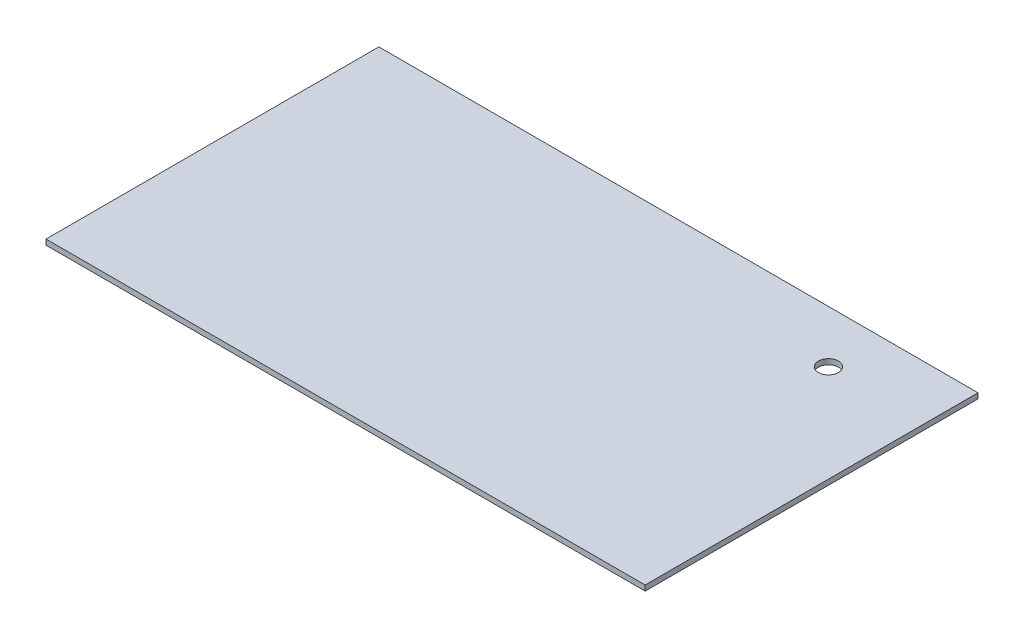
ISO-10303-21;
HEADER;
FILE_DESCRIPTION(('STEP AP214'),'2;1');
FILE_NAME('part.step','',(''),(''),'','','');
FILE_SCHEMA(('AUTOMOTIVE_DESIGN { 1 0 10303 214 1 1 1 1 }'));
ENDSEC;
DATA;
#1=APPLICATION_CONTEXT('core data for automotive mechanical design processes');
#2=APPLICATION_PROTOCOL_DEFINITION('international standard','automotive_design',2000,#1);
#3=PRODUCT_CONTEXT('',#1,'mechanical');
#4=PRODUCT('Part','Part','',(#3));
#5=PRODUCT_RELATED_PRODUCT_CATEGORY('part','',(#4));
#6=PRODUCT_DEFINITION_FORMATION('','',#4);
#7=PRODUCT_DEFINITION_CONTEXT('part definition',#1,'design');
#8=PRODUCT_DEFINITION('design','',#6,#7);
#9=PRODUCT_DEFINITION_SHAPE('','',#8);
#10=(LENGTH_UNIT() NAMED_UNIT(*) SI_UNIT(.MILLI.,.METRE.));
#11=(NAMED_UNIT(*) PLANE_ANGLE_UNIT() SI_UNIT($,.RADIAN.));
#12=(NAMED_UNIT(*) SI_UNIT($,.STERADIAN.) SOLID_ANGLE_UNIT());
#13=UNCERTAINTY_MEASURE_WITH_UNIT(LENGTH_MEASURE(1.E-05),#10,'distance_accuracy_value','');
#14=(GEOMETRIC_REPRESENTATION_CONTEXT(3) GLOBAL_UNCERTAINTY_ASSIGNED_CONTEXT((#13)) GLOBAL_UNIT_ASSIGNED_CONTEXT((#10,
#11,#12)) REPRESENTATION_CONTEXT('',''));
#15=CARTESIAN_POINT('',(0.,0.,0.));
#16=DIRECTION('',(0.,0.,1.));
#17=DIRECTION('',(1.,0.,0.));
#18=AXIS2_PLACEMENT_3D('',#15,#16,#17);
#19=CARTESIAN_POINT('',(0.,4.,-250.));
#20=DIRECTION('',(1.,0.,0.));
#21=DIRECTION('',(0.,0.,-1.));
#22=AXIS2_PLACEMENT_3D('',#19,#20,#21);
#23=PLANE('',#22);
#24=DIRECTION('',(0.,0.,1.));
#25=VECTOR('',#24,1.);
#26=CARTESIAN_POINT('',(0.,0.,-250.));
#27=LINE('',#26,#25);
#28=CARTESIAN_POINT('',(0.,0.,-250.));
#29=VERTEX_POINT('',#28);
#30=CARTESIAN_POINT('',(0.,0.,0.));
#31=VERTEX_POINT('',#30);
#32=EDGE_CURVE('E96',#29,#31,#27,.T.);
#33=ORIENTED_EDGE('',*,*,#32,.T.);
#34=DIRECTION('',(0.,-1.,0.));
#35=VECTOR('',#34,1.);
#36=CARTESIAN_POINT('',(0.,4.,0.));
#37=LINE('',#36,#35);
#38=CARTESIAN_POINT('',(0.,4.,0.));
#39=VERTEX_POINT('',#38);
#40=EDGE_CURVE('E11',#39,#31,#37,.T.);
#41=ORIENTED_EDGE('',*,*,#40,.F.);
#42=DIRECTION('',(0.,0.,1.));
#43=VECTOR('',#42,1.);
#44=CARTESIAN_POINT('',(0.,4.,-250.));
#45=LINE('',#44,#43);
#46=CARTESIAN_POINT('',(0.,4.,-250.));
#47=VERTEX_POINT('',#46);
#48=EDGE_CURVE('E84',#47,#39,#45,.T.);
#49=ORIENTED_EDGE('',*,*,#48,.F.);
#50=DIRECTION('',(0.,-1.,0.));
#51=VECTOR('',#50,1.);
#52=CARTESIAN_POINT('',(0.,4.,-250.));
#53=LINE('',#52,#51);
#54=EDGE_CURVE('E92',#47,#29,#53,.T.);
#55=ORIENTED_EDGE('',*,*,#54,.T.);
#56=EDGE_LOOP('',(#33,#41,#49,#55));
#57=FACE_BOUND('',#56,.T.);
#58=ADVANCED_FACE('F33',(#57),#23,.F.);
#59=CARTESIAN_POINT('',(0.,4.,0.));
#60=DIRECTION('',(0.,0.,-1.));
#61=DIRECTION('',(-1.,0.,0.));
#62=AXIS2_PLACEMENT_3D('',#59,#60,#61);
#63=PLANE('',#62);
#64=DIRECTION('',(1.,0.,0.));
#65=VECTOR('',#64,1.);
#66=CARTESIAN_POINT('',(0.,0.,0.));
#67=LINE('',#66,#65);
#68=CARTESIAN_POINT('',(450.,0.,0.));
#69=VERTEX_POINT('',#68);
#70=EDGE_CURVE('E88',#31,#69,#67,.T.);
#71=ORIENTED_EDGE('',*,*,#70,.T.);
#72=DIRECTION('',(0.,-1.,0.));
#73=VECTOR('',#72,1.);
#74=CARTESIAN_POINT('',(450.,4.,0.));
#75=LINE('',#74,#73);
#76=CARTESIAN_POINT('',(450.,4.,0.));
#77=VERTEX_POINT('',#76);
#78=EDGE_CURVE('E41',#77,#69,#75,.T.);
#79=ORIENTED_EDGE('',*,*,#78,.F.);
#80=DIRECTION('',(1.,0.,0.));
#81=VECTOR('',#80,1.);
#82=CARTESIAN_POINT('',(0.,4.,0.));
#83=LINE('',#82,#81);
#84=EDGE_CURVE('E79',#39,#77,#83,.T.);
#85=ORIENTED_EDGE('',*,*,#84,.F.);
#86=ORIENTED_EDGE('',*,*,#40,.T.);
#87=EDGE_LOOP('',(#71,#79,#85,#86));
#88=FACE_BOUND('',#87,.T.);
#89=ADVANCED_FACE('F87',(#88),#63,.F.);
#90=CARTESIAN_POINT('',(450.,4.,0.));
#91=DIRECTION('',(-1.,0.,0.));
#92=DIRECTION('',(0.,0.,1.));
#93=AXIS2_PLACEMENT_3D('',#90,#91,#92);
#94=PLANE('',#93);
#95=DIRECTION('',(0.,0.,-1.));
#96=VECTOR('',#95,1.);
#97=CARTESIAN_POINT('',(450.,0.,0.));
#98=LINE('',#97,#96);
#99=CARTESIAN_POINT('',(450.,0.,-250.));
#100=VERTEX_POINT('',#99);
#101=EDGE_CURVE('E66',#69,#100,#98,.T.);
#102=ORIENTED_EDGE('',*,*,#101,.T.);
#103=DIRECTION('',(0.,-1.,0.));
#104=VECTOR('',#103,1.);
#105=CARTESIAN_POINT('',(450.,4.,-250.));
#106=LINE('',#105,#104);
#107=CARTESIAN_POINT('',(450.,4.,-250.));
#108=VERTEX_POINT('',#107);
#109=EDGE_CURVE('E89',#108,#100,#106,.T.);
#110=ORIENTED_EDGE('',*,*,#109,.F.);
#111=DIRECTION('',(0.,0.,-1.));
#112=VECTOR('',#111,1.);
#113=CARTESIAN_POINT('',(450.,4.,0.));
#114=LINE('',#113,#112);
#115=EDGE_CURVE('E82',#77,#108,#114,.T.);
#116=ORIENTED_EDGE('',*,*,#115,.F.);
#117=ORIENTED_EDGE('',*,*,#78,.T.);
#118=EDGE_LOOP('',(#102,#110,#116,#117));
#119=FACE_BOUND('',#118,.T.);
#120=ADVANCED_FACE('F90',(#119),#94,.F.);
#121=CARTESIAN_POINT('',(450.,4.,-250.));
#122=DIRECTION('',(0.,0.,1.));
#123=DIRECTION('',(1.,0.,0.));
#124=AXIS2_PLACEMENT_3D('',#121,#122,#123);
#125=PLANE('',#124);
#126=DIRECTION('',(-1.,0.,0.));
#127=VECTOR('',#126,1.);
#128=CARTESIAN_POINT('',(450.,0.,-250.));
#129=LINE('',#128,#127);
#130=EDGE_CURVE('E72',#100,#29,#129,.T.);
#131=ORIENTED_EDGE('',*,*,#130,.T.);
#132=ORIENTED_EDGE('',*,*,#54,.F.);
#133=DIRECTION('',(-1.,0.,0.));
#134=VECTOR('',#133,1.);
#135=CARTESIAN_POINT('',(450.,4.,-250.));
#136=LINE('',#135,#134);
#137=EDGE_CURVE('E49',#108,#47,#136,.T.);
#138=ORIENTED_EDGE('',*,*,#137,.F.);
#139=ORIENTED_EDGE('',*,*,#109,.T.);
#140=EDGE_LOOP('',(#131,#132,#138,#139));
#141=FACE_BOUND('',#140,.T.);
#142=ADVANCED_FACE('F104',(#141),#125,.F.);
#143=CARTESIAN_POINT('',(0.,4.,0.));
#144=DIRECTION('',(0.,1.,0.));
#145=DIRECTION('',(0.,0.,1.));
#146=AXIS2_PLACEMENT_3D('',#143,#144,#145);
#147=PLANE('',#146);
#148=CARTESIAN_POINT('',(376.92,4.,-210.73));
#149=DIRECTION('',(0.,1.,0.));
#150=DIRECTION('',(0.,0.,1.));
#151=AXIS2_PLACEMENT_3D('',#148,#149,#150);
#152=CIRCLE('',#151,7.50000000000001);
#153=CARTESIAN_POINT('',(376.92,4.,-203.23));
#154=VERTEX_POINT('',#153);
#155=EDGE_CURVE('E110',#154,#154,#152,.T.);
#156=ORIENTED_EDGE('',*,*,#155,.F.);
#157=EDGE_LOOP('',(#156));
#158=FACE_BOUND('',#157,.T.);
#159=ORIENTED_EDGE('',*,*,#48,.T.);
#160=ORIENTED_EDGE('',*,*,#84,.T.);
#161=ORIENTED_EDGE('',*,*,#115,.T.);
#162=ORIENTED_EDGE('',*,*,#137,.T.);
#163=EDGE_LOOP('',(#159,#160,#161,#162));
#164=FACE_BOUND('',#163,.T.);
#165=ADVANCED_FACE('F80',(#158,#164),#147,.T.);
#166=CARTESIAN_POINT('',(0.,0.,0.));
#167=DIRECTION('',(0.,1.,0.));
#168=DIRECTION('',(0.,0.,1.));
#169=AXIS2_PLACEMENT_3D('',#166,#167,#168);
#170=PLANE('',#169);
#171=CARTESIAN_POINT('',(376.92,0.,-210.73));
#172=DIRECTION('',(0.,1.,0.));
#173=DIRECTION('',(0.,0.,1.));
#174=AXIS2_PLACEMENT_3D('',#171,#172,#173);
#175=CIRCLE('',#174,7.50000000000001);
#176=CARTESIAN_POINT('',(376.92,0.,-203.23));
#177=VERTEX_POINT('',#176);
#178=EDGE_CURVE('E99',#177,#177,#175,.T.);
#179=ORIENTED_EDGE('',*,*,#178,.T.);
#180=EDGE_LOOP('',(#179));
#181=FACE_BOUND('',#180,.T.);
#182=ORIENTED_EDGE('',*,*,#32,.F.);
#183=ORIENTED_EDGE('',*,*,#130,.F.);
#184=ORIENTED_EDGE('',*,*,#101,.F.);
#185=ORIENTED_EDGE('',*,*,#70,.F.);
#186=EDGE_LOOP('',(#182,#183,#184,#185));
#187=FACE_BOUND('',#186,.T.);
#188=ADVANCED_FACE('F107',(#181,#187),#170,.F.);
#189=CARTESIAN_POINT('',(376.92,0.,-210.73));
#190=DIRECTION('',(0.,1.,0.));
#191=DIRECTION('',(0.,0.,1.));
#192=AXIS2_PLACEMENT_3D('',#189,#190,#191);
#193=CYLINDRICAL_SURFACE('',#192,7.50000000000001);
#194=ORIENTED_EDGE('',*,*,#178,.F.);
#195=EDGE_LOOP('',(#194));
#196=FACE_BOUND('',#195,.T.);
#197=ORIENTED_EDGE('',*,*,#155,.T.);
#198=EDGE_LOOP('',(#197));
#199=FACE_BOUND('',#198,.T.);
#200=ADVANCED_FACE('F117',(#196,#199),#193,.F.);
#201=CLOSED_SHELL('',(#58,#89,#120,#142,#165,#188,#200));
#202=MANIFOLD_SOLID_BREP('B2',#201);
#203=ADVANCED_BREP_SHAPE_REPRESENTATION('',(#18,#202),#14);
#204=SHAPE_DEFINITION_REPRESENTATION(#9,#203);
ENDSEC;
END-ISO-10303-21;
